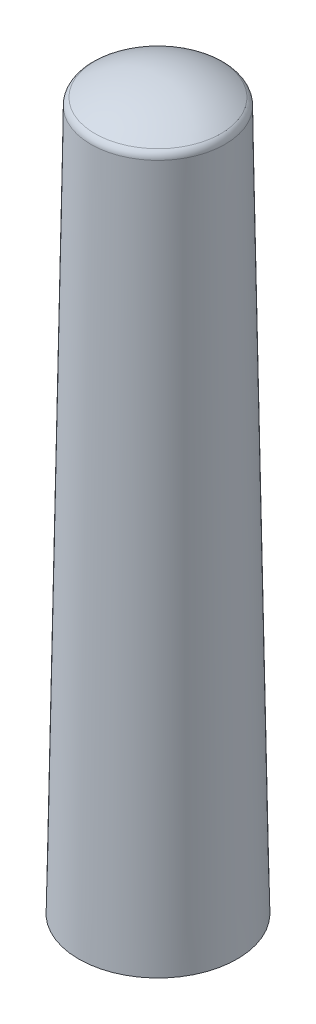
ISO-10303-21;
HEADER;
FILE_DESCRIPTION(('STEP AP214'),'2;1');
FILE_NAME('part.step','',(''),(''),'','','');
FILE_SCHEMA(('AUTOMOTIVE_DESIGN { 1 0 10303 214 1 1 1 1 }'));
ENDSEC;
DATA;
#1=APPLICATION_CONTEXT('core data for automotive mechanical design processes');
#2=APPLICATION_PROTOCOL_DEFINITION('international standard','automotive_design',2000,#1);
#3=PRODUCT_CONTEXT('',#1,'mechanical');
#4=PRODUCT('Part','Part','',(#3));
#5=PRODUCT_RELATED_PRODUCT_CATEGORY('part','',(#4));
#6=PRODUCT_DEFINITION_FORMATION('','',#4);
#7=PRODUCT_DEFINITION_CONTEXT('part definition',#1,'design');
#8=PRODUCT_DEFINITION('design','',#6,#7);
#9=PRODUCT_DEFINITION_SHAPE('','',#8);
#10=(LENGTH_UNIT() NAMED_UNIT(*) SI_UNIT(.MILLI.,.METRE.));
#11=(NAMED_UNIT(*) PLANE_ANGLE_UNIT() SI_UNIT($,.RADIAN.));
#12=(NAMED_UNIT(*) SI_UNIT($,.STERADIAN.) SOLID_ANGLE_UNIT());
#13=UNCERTAINTY_MEASURE_WITH_UNIT(LENGTH_MEASURE(1.E-05),#10,'distance_accuracy_value','');
#14=(GEOMETRIC_REPRESENTATION_CONTEXT(3) GLOBAL_UNCERTAINTY_ASSIGNED_CONTEXT((#13)) GLOBAL_UNIT_ASSIGNED_CONTEXT((#10,
#11,#12)) REPRESENTATION_CONTEXT('',''));
#15=CARTESIAN_POINT('',(0.,0.,0.));
#16=DIRECTION('',(0.,0.,1.));
#17=DIRECTION('',(1.,0.,0.));
#18=AXIS2_PLACEMENT_3D('',#15,#16,#17);
#19=CARTESIAN_POINT('',(0.,34.577640211467,0.));
#20=DIRECTION('',(0.,0.,1.));
#21=DIRECTION('',(1.,0.,0.));
#22=AXIS2_PLACEMENT_3D('',#19,#20,#21);
#23=SPHERICAL_SURFACE('',#22,6.62235978853297);
#24=CARTESIAN_POINT('',(0.,34.577640211467,0.));
#25=DIRECTION('',(0.,-1.,0.));
#26=DIRECTION('',(0.,0.,-1.));
#27=AXIS2_PLACEMENT_3D('',#24,#25,#26);
#28=SPHERICAL_SURFACE('',#27,6.62235978853297);
#29=CARTESIAN_POINT('',(0.,40.1512037658835,0.));
#30=DIRECTION('',(0.,-1.,0.));
#31=DIRECTION('',(0.,0.,-1.));
#32=AXIS2_PLACEMENT_3D('',#29,#30,#31);
#33=CIRCLE('',#32,3.57645613333352);
#34=CARTESIAN_POINT('',(0.,40.1512037658835,-3.57645613333352));
#35=VERTEX_POINT('',#34);
#36=EDGE_CURVE('E40',#35,#35,#33,.F.);
#37=ORIENTED_EDGE('',*,*,#36,.T.);
#38=EDGE_LOOP('',(#37));
#39=FACE_BOUND('',#38,.T.);
#40=ADVANCED_FACE('F33',(#39),#28,.T.);
#41=CARTESIAN_POINT('',(0.,0.,0.));
#42=DIRECTION('',(0.,1.,0.));
#43=DIRECTION('',(0.,0.,1.));
#44=AXIS2_PLACEMENT_3D('',#41,#42,#43);
#45=PLANE('',#44);
#46=CARTESIAN_POINT('',(0.,0.,0.));
#47=DIRECTION('',(0.,-1.,0.));
#48=DIRECTION('',(0.,0.,-1.));
#49=AXIS2_PLACEMENT_3D('',#46,#47,#48);
#50=CIRCLE('',#49,3.5);
#51=CARTESIAN_POINT('',(0.,0.,-3.5));
#52=VERTEX_POINT('',#51);
#53=EDGE_CURVE('E60',#52,#52,#50,.T.);
#54=ORIENTED_EDGE('',*,*,#53,.F.);
#55=EDGE_LOOP('',(#54));
#56=FACE_BOUND('',#55,.T.);
#57=CARTESIAN_POINT('',(0.,0.,0.));
#58=DIRECTION('',(0.,1.,0.));
#59=DIRECTION('',(0.,0.,1.));
#60=AXIS2_PLACEMENT_3D('',#57,#58,#59);
#61=CIRCLE('',#60,4.5);
#62=CARTESIAN_POINT('',(0.,0.,4.5));
#63=VERTEX_POINT('',#62);
#64=EDGE_CURVE('E56',#63,#63,#61,.T.);
#65=ORIENTED_EDGE('',*,*,#64,.F.);
#66=EDGE_LOOP('',(#65));
#67=FACE_BOUND('',#66,.T.);
#68=ADVANCED_FACE('F116',(#56,#67),#45,.F.);
#69=CARTESIAN_POINT('',(0.,0.5,0.));
#70=DIRECTION('',(0.,-1.,0.));
#71=DIRECTION('',(0.,0.,-1.));
#72=AXIS2_PLACEMENT_3D('',#69,#70,#71);
#73=CYLINDRICAL_SURFACE('',#72,3.5);
#74=CARTESIAN_POINT('',(0.,0.5,0.));
#75=DIRECTION('',(0.,-1.,0.));
#76=DIRECTION('',(0.,0.,-1.));
#77=AXIS2_PLACEMENT_3D('',#74,#75,#76);
#78=CIRCLE('',#77,3.5);
#79=CARTESIAN_POINT('',(0.,0.5,-3.5));
#80=VERTEX_POINT('',#79);
#81=EDGE_CURVE('E59',#80,#80,#78,.T.);
#82=ORIENTED_EDGE('',*,*,#81,.F.);
#83=EDGE_LOOP('',(#82));
#84=FACE_BOUND('',#83,.T.);
#85=ORIENTED_EDGE('',*,*,#53,.T.);
#86=EDGE_LOOP('',(#85));
#87=FACE_BOUND('',#86,.T.);
#88=ADVANCED_FACE('F110',(#84,#87),#73,.F.);
#89=CARTESIAN_POINT('',(0.,0.5,0.));
#90=DIRECTION('',(0.,-1.,0.));
#91=DIRECTION('',(0.,0.,-1.));
#92=AXIS2_PLACEMENT_3D('',#89,#90,#91);
#93=PLANE('',#92);
#94=CARTESIAN_POINT('',(0.,0.5,0.));
#95=DIRECTION('',(0.,-1.,0.));
#96=DIRECTION('',(0.,0.,-1.));
#97=AXIS2_PLACEMENT_3D('',#94,#95,#96);
#98=CIRCLE('',#97,3.);
#99=CARTESIAN_POINT('',(0.,0.5,-3.));
#100=VERTEX_POINT('',#99);
#101=EDGE_CURVE('E66',#100,#100,#98,.T.);
#102=ORIENTED_EDGE('',*,*,#101,.F.);
#103=EDGE_LOOP('',(#102));
#104=FACE_BOUND('',#103,.T.);
#105=ORIENTED_EDGE('',*,*,#81,.T.);
#106=EDGE_LOOP('',(#105));
#107=FACE_BOUND('',#106,.T.);
#108=ADVANCED_FACE('F104',(#104,#107),#93,.T.);
#109=CARTESIAN_POINT('',(0.,5.5,0.));
#110=DIRECTION('',(0.,-1.,0.));
#111=DIRECTION('',(0.,0.,-1.));
#112=AXIS2_PLACEMENT_3D('',#109,#110,#111);
#113=CYLINDRICAL_SURFACE('',#112,3.);
#114=CARTESIAN_POINT('',(0.,5.5,0.));
#115=DIRECTION('',(0.,-1.,0.));
#116=DIRECTION('',(0.,0.,-1.));
#117=AXIS2_PLACEMENT_3D('',#114,#115,#116);
#118=CIRCLE('',#117,3.);
#119=CARTESIAN_POINT('',(0.,5.5,-3.));
#120=VERTEX_POINT('',#119);
#121=EDGE_CURVE('E63',#120,#120,#118,.T.);
#122=ORIENTED_EDGE('',*,*,#121,.F.);
#123=EDGE_LOOP('',(#122));
#124=FACE_BOUND('',#123,.T.);
#125=ORIENTED_EDGE('',*,*,#101,.T.);
#126=EDGE_LOOP('',(#125));
#127=FACE_BOUND('',#126,.T.);
#128=ADVANCED_FACE('F98',(#124,#127),#113,.F.);
#129=CARTESIAN_POINT('',(0.,5.5,0.));
#130=DIRECTION('',(0.,-1.,0.));
#131=DIRECTION('',(0.,0.,-1.));
#132=AXIS2_PLACEMENT_3D('',#129,#130,#131);
#133=PLANE('',#132);
#134=CARTESIAN_POINT('',(0.,5.5,0.));
#135=DIRECTION('',(0.,-1.,0.));
#136=DIRECTION('',(0.,0.,-1.));
#137=AXIS2_PLACEMENT_3D('',#134,#135,#136);
#138=CIRCLE('',#137,2.);
#139=CARTESIAN_POINT('',(0.,5.5,-2.));
#140=VERTEX_POINT('',#139);
#141=EDGE_CURVE('E72',#140,#140,#138,.T.);
#142=ORIENTED_EDGE('',*,*,#141,.F.);
#143=EDGE_LOOP('',(#142));
#144=FACE_BOUND('',#143,.T.);
#145=ORIENTED_EDGE('',*,*,#121,.T.);
#146=EDGE_LOOP('',(#145));
#147=FACE_BOUND('',#146,.T.);
#148=ADVANCED_FACE('F92',(#144,#147),#133,.T.);
#149=CARTESIAN_POINT('',(0.,4.5,0.));
#150=DIRECTION('',(0.,1.,0.));
#151=DIRECTION('',(0.,0.,1.));
#152=AXIS2_PLACEMENT_3D('',#149,#150,#151);
#153=CYLINDRICAL_SURFACE('',#152,2.);
#154=CARTESIAN_POINT('',(0.,4.5,0.));
#155=DIRECTION('',(0.,-1.,0.));
#156=DIRECTION('',(0.,0.,-1.));
#157=AXIS2_PLACEMENT_3D('',#154,#155,#156);
#158=CIRCLE('',#157,2.);
#159=CARTESIAN_POINT('',(0.,4.5,-2.));
#160=VERTEX_POINT('',#159);
#161=EDGE_CURVE('E69',#160,#160,#158,.T.);
#162=ORIENTED_EDGE('',*,*,#161,.F.);
#163=EDGE_LOOP('',(#162));
#164=FACE_BOUND('',#163,.T.);
#165=ORIENTED_EDGE('',*,*,#141,.T.);
#166=EDGE_LOOP('',(#165));
#167=FACE_BOUND('',#166,.T.);
#168=ADVANCED_FACE('F86',(#164,#167),#153,.T.);
#169=CARTESIAN_POINT('',(0.,4.5,0.));
#170=DIRECTION('',(0.,-1.,0.));
#171=DIRECTION('',(0.,0.,-1.));
#172=AXIS2_PLACEMENT_3D('',#169,#170,#171);
#173=PLANE('',#172);
#174=CARTESIAN_POINT('',(0.,4.5,0.));
#175=DIRECTION('',(0.,-1.,0.));
#176=DIRECTION('',(0.,0.,-1.));
#177=AXIS2_PLACEMENT_3D('',#174,#175,#176);
#178=CIRCLE('',#177,0.6);
#179=CARTESIAN_POINT('',(0.,4.5,-0.6));
#180=VERTEX_POINT('',#179);
#181=EDGE_CURVE('E75',#180,#180,#178,.T.);
#182=ORIENTED_EDGE('',*,*,#181,.F.);
#183=EDGE_LOOP('',(#182));
#184=FACE_BOUND('',#183,.T.);
#185=ORIENTED_EDGE('',*,*,#161,.T.);
#186=EDGE_LOOP('',(#185));
#187=FACE_BOUND('',#186,.T.);
#188=ADVANCED_FACE('F83',(#184,#187),#173,.T.);
#189=CARTESIAN_POINT('',(0.,1.,0.));
#190=DIRECTION('',(0.,1.,0.));
#191=DIRECTION('',(0.,0.,1.));
#192=AXIS2_PLACEMENT_3D('',#189,#190,#191);
#193=CYLINDRICAL_SURFACE('',#192,0.6);
#194=CARTESIAN_POINT('',(0.,1.40000000000004,0.));
#195=DIRECTION('',(0.,-1.,0.));
#196=DIRECTION('',(0.,0.,-1.));
#197=AXIS2_PLACEMENT_3D('',#194,#195,#196);
#198=CIRCLE('',#197,0.6);
#199=CARTESIAN_POINT('',(0.,1.40000000000004,-0.6));
#200=VERTEX_POINT('',#199);
#201=EDGE_CURVE('E53',#200,#200,#198,.F.);
#202=ORIENTED_EDGE('',*,*,#201,.T.);
#203=EDGE_LOOP('',(#202));
#204=FACE_BOUND('',#203,.T.);
#205=ORIENTED_EDGE('',*,*,#181,.T.);
#206=EDGE_LOOP('',(#205));
#207=FACE_BOUND('',#206,.T.);
#208=ADVANCED_FACE('F81',(#204,#207),#193,.T.);
#209=CARTESIAN_POINT('',(0.,1.,0.));
#210=DIRECTION('',(0.,-1.,0.));
#211=DIRECTION('',(0.,0.,-1.));
#212=AXIS2_PLACEMENT_3D('',#209,#210,#211);
#213=PLANE('',#212);
#214=CARTESIAN_POINT('',(0.,1.,0.));
#215=DIRECTION('',(0.,-1.,0.));
#216=DIRECTION('',(0.,0.,-1.));
#217=AXIS2_PLACEMENT_3D('',#214,#215,#216);
#218=CIRCLE('',#217,0.314370398651565);
#219=CARTESIAN_POINT('',(0.,1.,-0.314370398651565));
#220=VERTEX_POINT('',#219);
#221=EDGE_CURVE('E48',#220,#220,#218,.T.);
#222=ORIENTED_EDGE('',*,*,#221,.T.);
#223=EDGE_LOOP('',(#222));
#224=FACE_BOUND('',#223,.T.);
#225=ADVANCED_FACE('F175',(#224),#213,.T.);
#226=CARTESIAN_POINT('',(0.,1.,0.));
#227=DIRECTION('',(0.,1.,0.));
#228=DIRECTION('',(0.,0.,1.));
#229=AXIS2_PLACEMENT_3D('',#226,#227,#228);
#230=CONICAL_SURFACE('',#229,0.454411906293507,0.349065850398861);
#231=CARTESIAN_POINT('',(0.,1.13159597133487,0.));
#232=DIRECTION('',(0.,-1.,0.));
#233=DIRECTION('',(0.,0.,-1.));
#234=AXIS2_PLACEMENT_3D('',#231,#232,#233);
#235=CIRCLE('',#234,0.502308922808747);
#236=CARTESIAN_POINT('',(0.,1.13159597133487,-0.502308922808747));
#237=VERTEX_POINT('',#236);
#238=EDGE_CURVE('E44',#237,#237,#235,.F.);
#239=ORIENTED_EDGE('',*,*,#238,.T.);
#240=EDGE_LOOP('',(#239));
#241=FACE_BOUND('',#240,.T.);
#242=ORIENTED_EDGE('',*,*,#201,.F.);
#243=EDGE_LOOP('',(#242));
#244=FACE_BOUND('',#243,.T.);
#245=ADVANCED_FACE('F134',(#241,#244),#230,.T.);
#246=CARTESIAN_POINT('',(0.,1.2,0.));
#247=DIRECTION('',(0.,-1.,0.));
#248=DIRECTION('',(0.,0.,-1.));
#249=AXIS2_PLACEMENT_3D('',#246,#247,#248);
#250=TOROIDAL_SURFACE('',#249,0.314370398651565,0.2);
#251=ORIENTED_EDGE('',*,*,#238,.F.);
#252=EDGE_LOOP('',(#251));
#253=FACE_BOUND('',#252,.T.);
#254=ORIENTED_EDGE('',*,*,#221,.F.);
#255=EDGE_LOOP('',(#254));
#256=FACE_BOUND('',#255,.T.);
#257=ADVANCED_FACE('F127',(#253,#256),#250,.T.);
#258=CARTESIAN_POINT('',(0.,40.,0.));
#259=DIRECTION('',(0.,-1.,0.));
#260=DIRECTION('',(0.,0.,-1.));
#261=AXIS2_PLACEMENT_3D('',#258,#259,#260);
#262=CONICAL_SURFACE('',#261,3.80179740287132,0.0174532925199409);
#263=CARTESIAN_POINT('',(0.,39.7391159592633,0.));
#264=DIRECTION('',(0.,1.,0.));
#265=DIRECTION('',(0.,0.,1.));
#266=AXIS2_PLACEMENT_3D('',#263,#264,#265);
#267=CIRCLE('',#266,3.80635115074111);
#268=CARTESIAN_POINT('',(0.,39.7391159592633,3.80635115074111));
#269=VERTEX_POINT('',#268);
#270=EDGE_CURVE('E10',#269,#269,#267,.F.);
#271=ORIENTED_EDGE('',*,*,#270,.T.);
#272=EDGE_LOOP('',(#271));
#273=FACE_BOUND('',#272,.T.);
#274=ORIENTED_EDGE('',*,*,#64,.T.);
#275=EDGE_LOOP('',(#274));
#276=FACE_BOUND('',#275,.T.);
#277=ADVANCED_FACE('F125',(#273,#276),#262,.T.);
#278=CARTESIAN_POINT('',(0.,39.7303897560447,0.));
#279=DIRECTION('',(0.,-1.,0.));
#280=DIRECTION('',(0.,0.,-1.));
#281=AXIS2_PLACEMENT_3D('',#278,#279,#280);
#282=TOROIDAL_SURFACE('',#281,3.30642730316292,0.5);
#283=ORIENTED_EDGE('',*,*,#270,.F.);
#284=EDGE_LOOP('',(#283));
#285=FACE_BOUND('',#284,.T.);
#286=ORIENTED_EDGE('',*,*,#36,.F.);
#287=EDGE_LOOP('',(#286));
#288=FACE_BOUND('',#287,.T.);
#289=ADVANCED_FACE('F35',(#285,#288),#282,.T.);
#290=CLOSED_SHELL('',(#40,#68,#88,#108,#128,#148,#168,#188,#208,#225,#245,#257,#277,#289));
#291=MANIFOLD_SOLID_BREP('B2',#290);
#292=ADVANCED_BREP_SHAPE_REPRESENTATION('',(#18,#291),#14);
#293=SHAPE_DEFINITION_REPRESENTATION(#9,#292);
ENDSEC;
END-ISO-10303-21;
